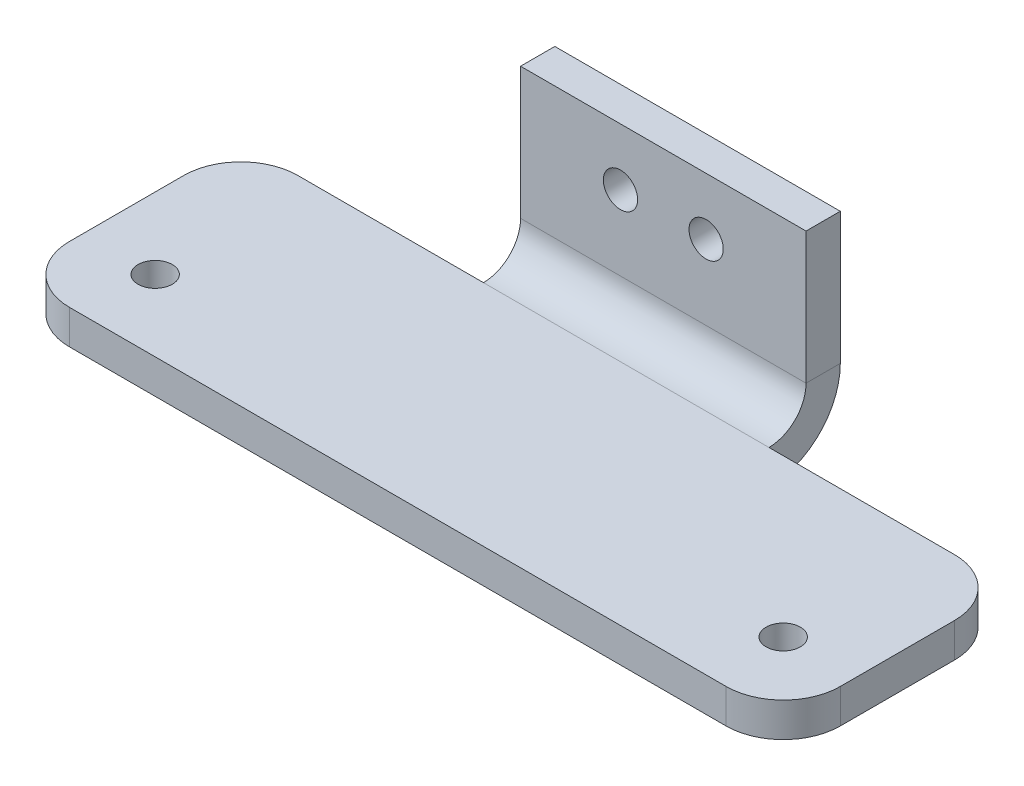
ISO-10303-21;
HEADER;
FILE_DESCRIPTION(('STEP AP214'),'2;1');
FILE_NAME('part.step','',(''),(''),'','','');
FILE_SCHEMA(('AUTOMOTIVE_DESIGN { 1 0 10303 214 1 1 1 1 }'));
ENDSEC;
DATA;
#1=APPLICATION_CONTEXT('core data for automotive mechanical design processes');
#2=APPLICATION_PROTOCOL_DEFINITION('international standard','automotive_design',2000,#1);
#3=PRODUCT_CONTEXT('',#1,'mechanical');
#4=PRODUCT('Part','Part','',(#3));
#5=PRODUCT_RELATED_PRODUCT_CATEGORY('part','',(#4));
#6=PRODUCT_DEFINITION_FORMATION('','',#4);
#7=PRODUCT_DEFINITION_CONTEXT('part definition',#1,'design');
#8=PRODUCT_DEFINITION('design','',#6,#7);
#9=PRODUCT_DEFINITION_SHAPE('','',#8);
#10=(LENGTH_UNIT() NAMED_UNIT(*) SI_UNIT(.MILLI.,.METRE.));
#11=(NAMED_UNIT(*) PLANE_ANGLE_UNIT() SI_UNIT($,.RADIAN.));
#12=(NAMED_UNIT(*) SI_UNIT($,.STERADIAN.) SOLID_ANGLE_UNIT());
#13=UNCERTAINTY_MEASURE_WITH_UNIT(LENGTH_MEASURE(1.E-05),#10,'distance_accuracy_value','');
#14=(GEOMETRIC_REPRESENTATION_CONTEXT(3) GLOBAL_UNCERTAINTY_ASSIGNED_CONTEXT((#13)) GLOBAL_UNIT_ASSIGNED_CONTEXT((#10,
#11,#12)) REPRESENTATION_CONTEXT('',''));
#15=CARTESIAN_POINT('',(0.,0.,0.));
#16=DIRECTION('',(0.,0.,1.));
#17=DIRECTION('',(1.,0.,0.));
#18=AXIS2_PLACEMENT_3D('',#15,#16,#17);
#19=CARTESIAN_POINT('',(0.,-28.4225651045515,-32.5000000000001));
#20=DIRECTION('',(0.,0.,1.));
#21=DIRECTION('',(0.,-1.,0.));
#22=AXIS2_PLACEMENT_3D('',#19,#20,#21);
#23=PLANE('',#22);
#24=CARTESIAN_POINT('',(-7.5,19.5774348954485,-32.5));
#25=DIRECTION('',(0.,0.,1.));
#26=DIRECTION('',(1.,0.,0.));
#27=AXIS2_PLACEMENT_3D('',#24,#25,#26);
#28=CIRCLE('',#27,3.);
#29=CARTESIAN_POINT('',(-4.5,19.5774348954485,-32.5));
#30=VERTEX_POINT('',#29);
#31=EDGE_CURVE('E394',#30,#30,#28,.T.);
#32=ORIENTED_EDGE('',*,*,#31,.T.);
#33=EDGE_LOOP('',(#32));
#34=FACE_BOUND('',#33,.T.);
#35=CARTESIAN_POINT('',(7.5,19.5774348954485,-32.5));
#36=DIRECTION('',(0.,0.,1.));
#37=DIRECTION('',(-1.,0.,0.));
#38=AXIS2_PLACEMENT_3D('',#35,#36,#37);
#39=CIRCLE('',#38,3.);
#40=CARTESIAN_POINT('',(4.5,19.5774348954485,-32.5));
#41=VERTEX_POINT('',#40);
#42=EDGE_CURVE('E398',#41,#41,#39,.T.);
#43=ORIENTED_EDGE('',*,*,#42,.T.);
#44=EDGE_LOOP('',(#43));
#45=FACE_BOUND('',#44,.T.);
#46=DIRECTION('',(0.,1.,0.));
#47=VECTOR('',#46,1.);
#48=CARTESIAN_POINT('',(25.,29.5774348954485,-32.4999999999999));
#49=LINE('',#48,#47);
#50=CARTESIAN_POINT('',(25.,6.50000000000005,-32.5));
#51=VERTEX_POINT('',#50);
#52=CARTESIAN_POINT('',(25.,29.5774348954485,-32.4999999999999));
#53=VERTEX_POINT('',#52);
#54=EDGE_CURVE('E172',#51,#53,#49,.T.);
#55=ORIENTED_EDGE('',*,*,#54,.F.);
#56=DIRECTION('',(-1.,0.,0.));
#57=VECTOR('',#56,1.);
#58=CARTESIAN_POINT('',(0.,6.50000000000005,-32.5));
#59=LINE('',#58,#57);
#60=CARTESIAN_POINT('',(-25.,6.50000000000005,-32.5));
#61=VERTEX_POINT('',#60);
#62=EDGE_CURVE('E146',#51,#61,#59,.T.);
#63=ORIENTED_EDGE('',*,*,#62,.T.);
#64=DIRECTION('',(0.,-1.,0.));
#65=VECTOR('',#64,1.);
#66=CARTESIAN_POINT('',(-25.,29.5774348954485,-32.4999999999999));
#67=LINE('',#66,#65);
#68=CARTESIAN_POINT('',(-25.,29.5774348954485,-32.4999999999999));
#69=VERTEX_POINT('',#68);
#70=EDGE_CURVE('E192',#69,#61,#67,.T.);
#71=ORIENTED_EDGE('',*,*,#70,.F.);
#72=DIRECTION('',(-1.,0.,0.));
#73=VECTOR('',#72,1.);
#74=CARTESIAN_POINT('',(-25.,29.5774348954485,-32.4999999999999));
#75=LINE('',#74,#73);
#76=EDGE_CURVE('E174',#53,#69,#75,.T.);
#77=ORIENTED_EDGE('',*,*,#76,.F.);
#78=EDGE_LOOP('',(#55,#63,#71,#77));
#79=FACE_BOUND('',#78,.T.);
#80=ADVANCED_FACE('F43',(#34,#45,#79),#23,.F.);
#81=CARTESIAN_POINT('',(-25.,29.5774348954485,-32.4999999999999));
#82=DIRECTION('',(-1.,0.,0.));
#83=DIRECTION('',(0.,-1.,0.));
#84=AXIS2_PLACEMENT_3D('',#81,#82,#83);
#85=PLANE('',#84);
#86=DIRECTION('',(0.,0.,-1.));
#87=VECTOR('',#86,1.);
#88=CARTESIAN_POINT('',(-25.,6.50000000000005,-32.5));
#89=LINE('',#88,#87);
#90=CARTESIAN_POINT('',(-25.,6.50000000000002,-26.5));
#91=VERTEX_POINT('',#90);
#92=EDGE_CURVE('E186',#91,#61,#89,.T.);
#93=ORIENTED_EDGE('',*,*,#92,.F.);
#94=DIRECTION('',(0.,-1.,0.));
#95=VECTOR('',#94,1.);
#96=CARTESIAN_POINT('',(-25.,29.5774348954485,-26.4999999999999));
#97=LINE('',#96,#95);
#98=CARTESIAN_POINT('',(-25.,29.5774348954485,-26.4999999999999));
#99=VERTEX_POINT('',#98);
#100=EDGE_CURVE('E178',#99,#91,#97,.T.);
#101=ORIENTED_EDGE('',*,*,#100,.F.);
#102=DIRECTION('',(0.,0.,1.));
#103=VECTOR('',#102,1.);
#104=CARTESIAN_POINT('',(-25.,29.5774348954485,-32.4999999999999));
#105=LINE('',#104,#103);
#106=EDGE_CURVE('E159',#69,#99,#105,.T.);
#107=ORIENTED_EDGE('',*,*,#106,.F.);
#108=ORIENTED_EDGE('',*,*,#70,.T.);
#109=EDGE_LOOP('',(#93,#101,#107,#108));
#110=FACE_BOUND('',#109,.T.);
#111=ADVANCED_FACE('F321',(#110),#85,.T.);
#112=CARTESIAN_POINT('',(-25.,29.5774348954485,-32.4999999999999));
#113=DIRECTION('',(0.,1.,0.));
#114=DIRECTION('',(-1.,0.,0.));
#115=AXIS2_PLACEMENT_3D('',#112,#113,#114);
#116=PLANE('',#115);
#117=DIRECTION('',(-1.,0.,0.));
#118=VECTOR('',#117,1.);
#119=CARTESIAN_POINT('',(-25.,29.5774348954485,-26.4999999999999));
#120=LINE('',#119,#118);
#121=CARTESIAN_POINT('',(25.,29.5774348954485,-26.4999999999999));
#122=VERTEX_POINT('',#121);
#123=EDGE_CURVE('E197',#122,#99,#120,.T.);
#124=ORIENTED_EDGE('',*,*,#123,.F.);
#125=DIRECTION('',(0.,0.,1.));
#126=VECTOR('',#125,1.);
#127=CARTESIAN_POINT('',(25.,29.5774348954485,-32.4999999999999));
#128=LINE('',#127,#126);
#129=EDGE_CURVE('E194',#53,#122,#128,.T.);
#130=ORIENTED_EDGE('',*,*,#129,.F.);
#131=ORIENTED_EDGE('',*,*,#76,.T.);
#132=ORIENTED_EDGE('',*,*,#106,.T.);
#133=EDGE_LOOP('',(#124,#130,#131,#132));
#134=FACE_BOUND('',#133,.T.);
#135=ADVANCED_FACE('F274',(#134),#116,.T.);
#136=CARTESIAN_POINT('',(25.,29.5774348954485,-32.4999999999999));
#137=DIRECTION('',(1.,0.,0.));
#138=DIRECTION('',(0.,1.,0.));
#139=AXIS2_PLACEMENT_3D('',#136,#137,#138);
#140=PLANE('',#139);
#141=DIRECTION('',(0.,0.,1.));
#142=VECTOR('',#141,1.);
#143=CARTESIAN_POINT('',(25.,6.50000000000005,-32.5));
#144=LINE('',#143,#142);
#145=CARTESIAN_POINT('',(25.,6.50000000000002,-26.5));
#146=VERTEX_POINT('',#145);
#147=EDGE_CURVE('E158',#51,#146,#144,.T.);
#148=ORIENTED_EDGE('',*,*,#147,.F.);
#149=ORIENTED_EDGE('',*,*,#54,.T.);
#150=ORIENTED_EDGE('',*,*,#129,.T.);
#151=DIRECTION('',(0.,1.,0.));
#152=VECTOR('',#151,1.);
#153=CARTESIAN_POINT('',(25.,29.5774348954485,-26.4999999999999));
#154=LINE('',#153,#152);
#155=EDGE_CURVE('E182',#146,#122,#154,.T.);
#156=ORIENTED_EDGE('',*,*,#155,.F.);
#157=EDGE_LOOP('',(#148,#149,#150,#156));
#158=FACE_BOUND('',#157,.T.);
#159=ADVANCED_FACE('F181',(#158),#140,.T.);
#160=CARTESIAN_POINT('',(0.,-28.4225651045515,-26.5000000000001));
#161=DIRECTION('',(0.,0.,1.));
#162=DIRECTION('',(0.,-1.,0.));
#163=AXIS2_PLACEMENT_3D('',#160,#161,#162);
#164=PLANE('',#163);
#165=CARTESIAN_POINT('',(-7.5,19.5774348954485,-26.5));
#166=DIRECTION('',(0.,0.,1.));
#167=DIRECTION('',(1.,0.,0.));
#168=AXIS2_PLACEMENT_3D('',#165,#166,#167);
#169=CIRCLE('',#168,3.);
#170=CARTESIAN_POINT('',(-4.5,19.5774348954485,-26.5));
#171=VERTEX_POINT('',#170);
#172=EDGE_CURVE('E397',#171,#171,#169,.T.);
#173=ORIENTED_EDGE('',*,*,#172,.F.);
#174=EDGE_LOOP('',(#173));
#175=FACE_BOUND('',#174,.T.);
#176=CARTESIAN_POINT('',(7.5,19.5774348954485,-26.5));
#177=DIRECTION('',(0.,0.,1.));
#178=DIRECTION('',(-1.,0.,0.));
#179=AXIS2_PLACEMENT_3D('',#176,#177,#178);
#180=CIRCLE('',#179,3.);
#181=CARTESIAN_POINT('',(4.5,19.5774348954485,-26.5));
#182=VERTEX_POINT('',#181);
#183=EDGE_CURVE('E403',#182,#182,#180,.T.);
#184=ORIENTED_EDGE('',*,*,#183,.F.);
#185=EDGE_LOOP('',(#184));
#186=FACE_BOUND('',#185,.T.);
#187=DIRECTION('',(-1.,0.,0.));
#188=VECTOR('',#187,1.);
#189=CARTESIAN_POINT('',(0.,6.50000000000003,-26.5));
#190=LINE('',#189,#188);
#191=EDGE_CURVE('E184',#146,#91,#190,.T.);
#192=ORIENTED_EDGE('',*,*,#191,.F.);
#193=ORIENTED_EDGE('',*,*,#155,.T.);
#194=ORIENTED_EDGE('',*,*,#123,.T.);
#195=ORIENTED_EDGE('',*,*,#100,.T.);
#196=EDGE_LOOP('',(#192,#193,#194,#195));
#197=FACE_BOUND('',#196,.T.);
#198=ADVANCED_FACE('F277',(#175,#186,#197),#164,.T.);
#199=CARTESIAN_POINT('',(-67.5,-6.,-20.));
#200=DIRECTION('',(-1.,0.,0.));
#201=DIRECTION('',(0.,0.,1.));
#202=AXIS2_PLACEMENT_3D('',#199,#200,#201);
#203=PLANE('',#202);
#204=DIRECTION('',(0.,0.,1.));
#205=VECTOR('',#204,1.);
#206=CARTESIAN_POINT('',(-67.5,-6.,-20.));
#207=LINE('',#206,#205);
#208=CARTESIAN_POINT('',(-67.5,-6.,-10.));
#209=VERTEX_POINT('',#208);
#210=CARTESIAN_POINT('',(-67.5,-6.,9.99999999999999));
#211=VERTEX_POINT('',#210);
#212=EDGE_CURVE('E234',#209,#211,#207,.T.);
#213=ORIENTED_EDGE('',*,*,#212,.T.);
#214=DIRECTION('',(0.,1.,0.));
#215=VECTOR('',#214,1.);
#216=CARTESIAN_POINT('',(-67.5,-6.,9.99999999999999));
#217=LINE('',#216,#215);
#218=CARTESIAN_POINT('',(-67.5,0.,9.99999999999999));
#219=VERTEX_POINT('',#218);
#220=EDGE_CURVE('E51',#211,#219,#217,.T.);
#221=ORIENTED_EDGE('',*,*,#220,.T.);
#222=DIRECTION('',(0.,0.,1.));
#223=VECTOR('',#222,1.);
#224=CARTESIAN_POINT('',(-67.5,0.,-20.));
#225=LINE('',#224,#223);
#226=CARTESIAN_POINT('',(-67.5,0.,-10.));
#227=VERTEX_POINT('',#226);
#228=EDGE_CURVE('E232',#227,#219,#225,.T.);
#229=ORIENTED_EDGE('',*,*,#228,.F.);
#230=DIRECTION('',(0.,1.,0.));
#231=VECTOR('',#230,1.);
#232=CARTESIAN_POINT('',(-67.5,-6.,-10.));
#233=LINE('',#232,#231);
#234=EDGE_CURVE('E225',#227,#209,#233,.F.);
#235=ORIENTED_EDGE('',*,*,#234,.T.);
#236=EDGE_LOOP('',(#213,#221,#229,#235));
#237=FACE_BOUND('',#236,.T.);
#238=ADVANCED_FACE('F231',(#237),#203,.T.);
#239=CARTESIAN_POINT('',(-67.5,-6.,20.));
#240=DIRECTION('',(0.,0.,1.));
#241=DIRECTION('',(1.,0.,0.));
#242=AXIS2_PLACEMENT_3D('',#239,#240,#241);
#243=PLANE('',#242);
#244=DIRECTION('',(1.,0.,0.));
#245=VECTOR('',#244,1.);
#246=CARTESIAN_POINT('',(-67.5,-6.,20.));
#247=LINE('',#246,#245);
#248=CARTESIAN_POINT('',(-57.5,-6.,20.));
#249=VERTEX_POINT('',#248);
#250=CARTESIAN_POINT('',(57.5,-6.,20.));
#251=VERTEX_POINT('',#250);
#252=EDGE_CURVE('E261',#249,#251,#247,.T.);
#253=ORIENTED_EDGE('',*,*,#252,.T.);
#254=DIRECTION('',(0.,1.,0.));
#255=VECTOR('',#254,1.);
#256=CARTESIAN_POINT('',(57.5,-6.,20.));
#257=LINE('',#256,#255);
#258=CARTESIAN_POINT('',(57.5,0.,20.));
#259=VERTEX_POINT('',#258);
#260=EDGE_CURVE('E222',#251,#259,#257,.T.);
#261=ORIENTED_EDGE('',*,*,#260,.T.);
#262=DIRECTION('',(1.,0.,0.));
#263=VECTOR('',#262,1.);
#264=CARTESIAN_POINT('',(-67.5,0.,20.));
#265=LINE('',#264,#263);
#266=CARTESIAN_POINT('',(-57.5,0.,20.));
#267=VERTEX_POINT('',#266);
#268=EDGE_CURVE('E242',#267,#259,#265,.T.);
#269=ORIENTED_EDGE('',*,*,#268,.F.);
#270=DIRECTION('',(0.,1.,0.));
#271=VECTOR('',#270,1.);
#272=CARTESIAN_POINT('',(-57.5,-6.,20.));
#273=LINE('',#272,#271);
#274=EDGE_CURVE('E220',#267,#249,#273,.F.);
#275=ORIENTED_EDGE('',*,*,#274,.T.);
#276=EDGE_LOOP('',(#253,#261,#269,#275));
#277=FACE_BOUND('',#276,.T.);
#278=ADVANCED_FACE('F308',(#277),#243,.T.);
#279=CARTESIAN_POINT('',(67.5,-6.,-20.));
#280=DIRECTION('',(1.,0.,0.));
#281=DIRECTION('',(0.,0.,-1.));
#282=AXIS2_PLACEMENT_3D('',#279,#280,#281);
#283=PLANE('',#282);
#284=DIRECTION('',(0.,0.,-1.));
#285=VECTOR('',#284,1.);
#286=CARTESIAN_POINT('',(67.5,-6.,-20.));
#287=LINE('',#286,#285);
#288=CARTESIAN_POINT('',(67.5,-6.,10.));
#289=VERTEX_POINT('',#288);
#290=CARTESIAN_POINT('',(67.5,-6.,-10.));
#291=VERTEX_POINT('',#290);
#292=EDGE_CURVE('E258',#289,#291,#287,.T.);
#293=ORIENTED_EDGE('',*,*,#292,.T.);
#294=DIRECTION('',(0.,1.,0.));
#295=VECTOR('',#294,1.);
#296=CARTESIAN_POINT('',(67.5,-6.,-10.));
#297=LINE('',#296,#295);
#298=CARTESIAN_POINT('',(67.5,0.,-10.));
#299=VERTEX_POINT('',#298);
#300=EDGE_CURVE('E201',#291,#299,#297,.T.);
#301=ORIENTED_EDGE('',*,*,#300,.T.);
#302=DIRECTION('',(0.,0.,-1.));
#303=VECTOR('',#302,1.);
#304=CARTESIAN_POINT('',(67.5,0.,-20.));
#305=LINE('',#304,#303);
#306=CARTESIAN_POINT('',(67.5,0.,10.));
#307=VERTEX_POINT('',#306);
#308=EDGE_CURVE('E245',#307,#299,#305,.T.);
#309=ORIENTED_EDGE('',*,*,#308,.F.);
#310=DIRECTION('',(0.,1.,0.));
#311=VECTOR('',#310,1.);
#312=CARTESIAN_POINT('',(67.5,-6.,10.));
#313=LINE('',#312,#311);
#314=EDGE_CURVE('E191',#307,#289,#313,.F.);
#315=ORIENTED_EDGE('',*,*,#314,.T.);
#316=EDGE_LOOP('',(#293,#301,#309,#315));
#317=FACE_BOUND('',#316,.T.);
#318=ADVANCED_FACE('F298',(#317),#283,.T.);
#319=CARTESIAN_POINT('',(0.,-6.,0.));
#320=DIRECTION('',(0.,1.,0.));
#321=DIRECTION('',(0.,0.,1.));
#322=AXIS2_PLACEMENT_3D('',#319,#320,#321);
#323=PLANE('',#322);
#324=CARTESIAN_POINT('',(-55.,-6.,7.5));
#325=DIRECTION('',(0.,1.,0.));
#326=DIRECTION('',(0.,0.,1.));
#327=AXIS2_PLACEMENT_3D('',#324,#325,#326);
#328=CIRCLE('',#327,3.);
#329=CARTESIAN_POINT('',(-55.,-6.,10.5));
#330=VERTEX_POINT('',#329);
#331=EDGE_CURVE('E290',#330,#330,#328,.T.);
#332=ORIENTED_EDGE('',*,*,#331,.T.);
#333=EDGE_LOOP('',(#332));
#334=FACE_BOUND('',#333,.T.);
#335=CARTESIAN_POINT('',(55.,-6.,7.49999999999999));
#336=DIRECTION('',(0.,1.,0.));
#337=DIRECTION('',(0.,0.,-1.));
#338=AXIS2_PLACEMENT_3D('',#335,#336,#337);
#339=CIRCLE('',#338,3.);
#340=CARTESIAN_POINT('',(55.,-6.,4.49999999999999));
#341=VERTEX_POINT('',#340);
#342=EDGE_CURVE('E413',#341,#341,#339,.T.);
#343=ORIENTED_EDGE('',*,*,#342,.T.);
#344=EDGE_LOOP('',(#343));
#345=FACE_BOUND('',#344,.T.);
#346=DIRECTION('',(-1.,0.,0.));
#347=VECTOR('',#346,1.);
#348=CARTESIAN_POINT('',(25.,-6.,-20.));
#349=LINE('',#348,#347);
#350=CARTESIAN_POINT('',(57.5,-6.,-20.));
#351=VERTEX_POINT('',#350);
#352=CARTESIAN_POINT('',(25.,-6.,-20.));
#353=VERTEX_POINT('',#352);
#354=EDGE_CURVE('E256',#351,#353,#349,.T.);
#355=ORIENTED_EDGE('',*,*,#354,.F.);
#356=CARTESIAN_POINT('',(57.5,-6.,-10.));
#357=DIRECTION('',(0.,1.,0.));
#358=DIRECTION('',(0.,0.,1.));
#359=AXIS2_PLACEMENT_3D('',#356,#357,#358);
#360=CIRCLE('',#359,10.);
#361=EDGE_CURVE('E218',#351,#291,#360,.F.);
#362=ORIENTED_EDGE('',*,*,#361,.T.);
#363=ORIENTED_EDGE('',*,*,#292,.F.);
#364=CARTESIAN_POINT('',(57.5,-6.,10.));
#365=DIRECTION('',(0.,1.,0.));
#366=DIRECTION('',(0.,0.,1.));
#367=AXIS2_PLACEMENT_3D('',#364,#365,#366);
#368=CIRCLE('',#367,10.);
#369=EDGE_CURVE('E216',#289,#251,#368,.F.);
#370=ORIENTED_EDGE('',*,*,#369,.T.);
#371=ORIENTED_EDGE('',*,*,#252,.F.);
#372=CARTESIAN_POINT('',(-57.5,-6.,10.));
#373=DIRECTION('',(0.,1.,0.));
#374=DIRECTION('',(0.,0.,1.));
#375=AXIS2_PLACEMENT_3D('',#372,#373,#374);
#376=CIRCLE('',#375,10.);
#377=EDGE_CURVE('E64',#249,#211,#376,.F.);
#378=ORIENTED_EDGE('',*,*,#377,.T.);
#379=ORIENTED_EDGE('',*,*,#212,.F.);
#380=CARTESIAN_POINT('',(-57.5,-6.,-10.));
#381=DIRECTION('',(0.,1.,0.));
#382=DIRECTION('',(0.,0.,1.));
#383=AXIS2_PLACEMENT_3D('',#380,#381,#382);
#384=CIRCLE('',#383,10.);
#385=CARTESIAN_POINT('',(-57.5,-6.,-20.));
#386=VERTEX_POINT('',#385);
#387=EDGE_CURVE('E58',#209,#386,#384,.F.);
#388=ORIENTED_EDGE('',*,*,#387,.T.);
#389=DIRECTION('',(-1.,0.,0.));
#390=VECTOR('',#389,1.);
#391=CARTESIAN_POINT('',(-67.5,-6.,-20.));
#392=LINE('',#391,#390);
#393=CARTESIAN_POINT('',(-25.,-6.,-20.));
#394=VERTEX_POINT('',#393);
#395=EDGE_CURVE('E198',#394,#386,#392,.T.);
#396=ORIENTED_EDGE('',*,*,#395,.F.);
#397=DIRECTION('',(-1.,0.,0.));
#398=VECTOR('',#397,1.);
#399=CARTESIAN_POINT('',(0.,-6.,-20.));
#400=LINE('',#399,#398);
#401=EDGE_CURVE('E267',#353,#394,#400,.T.);
#402=ORIENTED_EDGE('',*,*,#401,.F.);
#403=EDGE_LOOP('',(#355,#362,#363,#370,#371,#378,#379,#388,#396,#402));
#404=FACE_BOUND('',#403,.T.);
#405=ADVANCED_FACE('F306',(#334,#345,#404),#323,.F.);
#406=CARTESIAN_POINT('',(25.,-6.,-20.));
#407=DIRECTION('',(0.,0.,-1.));
#408=DIRECTION('',(-1.,0.,0.));
#409=AXIS2_PLACEMENT_3D('',#406,#407,#408);
#410=PLANE('',#409);
#411=DIRECTION('',(-1.,0.,0.));
#412=VECTOR('',#411,1.);
#413=CARTESIAN_POINT('',(25.,0.,-20.));
#414=LINE('',#413,#412);
#415=CARTESIAN_POINT('',(57.5,0.,-20.));
#416=VERTEX_POINT('',#415);
#417=CARTESIAN_POINT('',(25.,0.,-20.));
#418=VERTEX_POINT('',#417);
#419=EDGE_CURVE('E253',#416,#418,#414,.T.);
#420=ORIENTED_EDGE('',*,*,#419,.F.);
#421=DIRECTION('',(0.,1.,0.));
#422=VECTOR('',#421,1.);
#423=CARTESIAN_POINT('',(57.5,-6.,-20.));
#424=LINE('',#423,#422);
#425=EDGE_CURVE('E212',#416,#351,#424,.F.);
#426=ORIENTED_EDGE('',*,*,#425,.T.);
#427=ORIENTED_EDGE('',*,*,#354,.T.);
#428=DIRECTION('',(0.,1.,0.));
#429=VECTOR('',#428,1.);
#430=CARTESIAN_POINT('',(25.,-6.,-20.));
#431=LINE('',#430,#429);
#432=EDGE_CURVE('E168',#353,#418,#431,.T.);
#433=ORIENTED_EDGE('',*,*,#432,.T.);
#434=EDGE_LOOP('',(#420,#426,#427,#433));
#435=FACE_BOUND('',#434,.T.);
#436=ADVANCED_FACE('F351',(#435),#410,.T.);
#437=CARTESIAN_POINT('',(0.,0.,0.));
#438=DIRECTION('',(0.,1.,0.));
#439=DIRECTION('',(0.,0.,1.));
#440=AXIS2_PLACEMENT_3D('',#437,#438,#439);
#441=PLANE('',#440);
#442=CARTESIAN_POINT('',(-55.,0.,7.5));
#443=DIRECTION('',(0.,1.,0.));
#444=DIRECTION('',(0.,0.,1.));
#445=AXIS2_PLACEMENT_3D('',#442,#443,#444);
#446=CIRCLE('',#445,3.);
#447=CARTESIAN_POINT('',(-55.,0.,10.5));
#448=VERTEX_POINT('',#447);
#449=EDGE_CURVE('E410',#448,#448,#446,.T.);
#450=ORIENTED_EDGE('',*,*,#449,.F.);
#451=EDGE_LOOP('',(#450));
#452=FACE_BOUND('',#451,.T.);
#453=CARTESIAN_POINT('',(55.,0.,7.49999999999999));
#454=DIRECTION('',(0.,1.,0.));
#455=DIRECTION('',(0.,0.,-1.));
#456=AXIS2_PLACEMENT_3D('',#453,#454,#455);
#457=CIRCLE('',#456,3.);
#458=CARTESIAN_POINT('',(55.,0.,4.49999999999999));
#459=VERTEX_POINT('',#458);
#460=EDGE_CURVE('E400',#459,#459,#457,.T.);
#461=ORIENTED_EDGE('',*,*,#460,.F.);
#462=EDGE_LOOP('',(#461));
#463=FACE_BOUND('',#462,.T.);
#464=ORIENTED_EDGE('',*,*,#308,.T.);
#465=CARTESIAN_POINT('',(57.5,0.,-10.));
#466=DIRECTION('',(0.,1.,0.));
#467=DIRECTION('',(0.,0.,1.));
#468=AXIS2_PLACEMENT_3D('',#465,#466,#467);
#469=CIRCLE('',#468,10.);
#470=EDGE_CURVE('E210',#299,#416,#469,.T.);
#471=ORIENTED_EDGE('',*,*,#470,.T.);
#472=ORIENTED_EDGE('',*,*,#419,.T.);
#473=DIRECTION('',(-1.,0.,0.));
#474=VECTOR('',#473,1.);
#475=CARTESIAN_POINT('',(0.,0.,-20.));
#476=LINE('',#475,#474);
#477=CARTESIAN_POINT('',(-25.,0.,-20.));
#478=VERTEX_POINT('',#477);
#479=EDGE_CURVE('E247',#418,#478,#476,.T.);
#480=ORIENTED_EDGE('',*,*,#479,.T.);
#481=DIRECTION('',(-1.,0.,0.));
#482=VECTOR('',#481,1.);
#483=CARTESIAN_POINT('',(-67.5,0.,-20.));
#484=LINE('',#483,#482);
#485=CARTESIAN_POINT('',(-57.5,0.,-20.));
#486=VERTEX_POINT('',#485);
#487=EDGE_CURVE('E243',#478,#486,#484,.T.);
#488=ORIENTED_EDGE('',*,*,#487,.T.);
#489=CARTESIAN_POINT('',(-57.5,0.,-10.));
#490=DIRECTION('',(0.,1.,0.));
#491=DIRECTION('',(0.,0.,1.));
#492=AXIS2_PLACEMENT_3D('',#489,#490,#491);
#493=CIRCLE('',#492,10.);
#494=EDGE_CURVE('E204',#486,#227,#493,.T.);
#495=ORIENTED_EDGE('',*,*,#494,.T.);
#496=ORIENTED_EDGE('',*,*,#228,.T.);
#497=CARTESIAN_POINT('',(-57.5,0.,10.));
#498=DIRECTION('',(0.,1.,0.));
#499=DIRECTION('',(0.,0.,1.));
#500=AXIS2_PLACEMENT_3D('',#497,#498,#499);
#501=CIRCLE('',#500,10.);
#502=EDGE_CURVE('E206',#219,#267,#501,.T.);
#503=ORIENTED_EDGE('',*,*,#502,.T.);
#504=ORIENTED_EDGE('',*,*,#268,.T.);
#505=CARTESIAN_POINT('',(57.5,0.,10.));
#506=DIRECTION('',(0.,1.,0.));
#507=DIRECTION('',(0.,0.,1.));
#508=AXIS2_PLACEMENT_3D('',#505,#506,#507);
#509=CIRCLE('',#508,10.);
#510=EDGE_CURVE('E208',#259,#307,#509,.T.);
#511=ORIENTED_EDGE('',*,*,#510,.T.);
#512=EDGE_LOOP('',(#464,#471,#472,#480,#488,#495,#496,#503,#504,#511));
#513=FACE_BOUND('',#512,.T.);
#514=ADVANCED_FACE('F238',(#452,#463,#513),#441,.T.);
#515=CARTESIAN_POINT('',(-67.5,-6.,-20.));
#516=DIRECTION('',(0.,0.,-1.));
#517=DIRECTION('',(-1.,0.,0.));
#518=AXIS2_PLACEMENT_3D('',#515,#516,#517);
#519=PLANE('',#518);
#520=ORIENTED_EDGE('',*,*,#395,.T.);
#521=DIRECTION('',(0.,1.,0.));
#522=VECTOR('',#521,1.);
#523=CARTESIAN_POINT('',(-57.5,-6.,-20.));
#524=LINE('',#523,#522);
#525=EDGE_CURVE('E12',#386,#486,#524,.T.);
#526=ORIENTED_EDGE('',*,*,#525,.T.);
#527=ORIENTED_EDGE('',*,*,#487,.F.);
#528=DIRECTION('',(0.,1.,0.));
#529=VECTOR('',#528,1.);
#530=CARTESIAN_POINT('',(-25.,-6.,-20.));
#531=LINE('',#530,#529);
#532=EDGE_CURVE('E265',#394,#478,#531,.T.);
#533=ORIENTED_EDGE('',*,*,#532,.F.);
#534=EDGE_LOOP('',(#520,#526,#527,#533));
#535=FACE_BOUND('',#534,.T.);
#536=ADVANCED_FACE('F353',(#535),#519,.T.);
#537=CARTESIAN_POINT('',(25.,6.5,-20.));
#538=DIRECTION('',(1.,0.,0.));
#539=DIRECTION('',(0.,0.,-1.));
#540=AXIS2_PLACEMENT_3D('',#537,#538,#539);
#541=PLANE('',#540);
#542=ORIENTED_EDGE('',*,*,#147,.T.);
#543=CARTESIAN_POINT('',(25.,6.5,-20.));
#544=DIRECTION('',(1.,0.,0.));
#545=DIRECTION('',(0.,0.,-1.));
#546=AXIS2_PLACEMENT_3D('',#543,#544,#545);
#547=CIRCLE('',#546,6.5);
#548=EDGE_CURVE('E285',#146,#418,#547,.F.);
#549=ORIENTED_EDGE('',*,*,#548,.T.);
#550=ORIENTED_EDGE('',*,*,#432,.F.);
#551=CARTESIAN_POINT('',(25.,6.5,-20.));
#552=DIRECTION('',(-1.,0.,0.));
#553=DIRECTION('',(0.,0.,-1.));
#554=AXIS2_PLACEMENT_3D('',#551,#552,#553);
#555=CIRCLE('',#554,12.5);
#556=EDGE_CURVE('E149',#51,#353,#555,.T.);
#557=ORIENTED_EDGE('',*,*,#556,.F.);
#558=EDGE_LOOP('',(#542,#549,#550,#557));
#559=FACE_BOUND('',#558,.T.);
#560=ADVANCED_FACE('F163',(#559),#541,.T.);
#561=CARTESIAN_POINT('',(-25.,6.5,-20.));
#562=DIRECTION('',(-1.,0.,0.));
#563=DIRECTION('',(0.,0.,1.));
#564=AXIS2_PLACEMENT_3D('',#561,#562,#563);
#565=PLANE('',#564);
#566=CARTESIAN_POINT('',(-25.,6.5,-20.));
#567=DIRECTION('',(1.,0.,0.));
#568=DIRECTION('',(0.,0.,-1.));
#569=AXIS2_PLACEMENT_3D('',#566,#567,#568);
#570=CIRCLE('',#569,6.5);
#571=EDGE_CURVE('E169',#478,#91,#570,.T.);
#572=ORIENTED_EDGE('',*,*,#571,.T.);
#573=ORIENTED_EDGE('',*,*,#92,.T.);
#574=CARTESIAN_POINT('',(-25.,6.5,-20.));
#575=DIRECTION('',(1.,0.,0.));
#576=DIRECTION('',(0.,0.,1.));
#577=AXIS2_PLACEMENT_3D('',#574,#575,#576);
#578=CIRCLE('',#577,12.5);
#579=EDGE_CURVE('E152',#394,#61,#578,.T.);
#580=ORIENTED_EDGE('',*,*,#579,.F.);
#581=ORIENTED_EDGE('',*,*,#532,.T.);
#582=EDGE_LOOP('',(#572,#573,#580,#581));
#583=FACE_BOUND('',#582,.T.);
#584=ADVANCED_FACE('F287',(#583),#565,.T.);
#585=CARTESIAN_POINT('',(-52.5231658347017,6.5,-20.));
#586=DIRECTION('',(1.,0.,0.));
#587=DIRECTION('',(0.,0.,-1.));
#588=AXIS2_PLACEMENT_3D('',#585,#586,#587);
#589=CYLINDRICAL_SURFACE('',#588,12.5);
#590=ORIENTED_EDGE('',*,*,#401,.T.);
#591=ORIENTED_EDGE('',*,*,#579,.T.);
#592=ORIENTED_EDGE('',*,*,#62,.F.);
#593=ORIENTED_EDGE('',*,*,#556,.T.);
#594=EDGE_LOOP('',(#590,#591,#592,#593));
#595=FACE_BOUND('',#594,.T.);
#596=ADVANCED_FACE('F148',(#595),#589,.T.);
#597=CARTESIAN_POINT('',(-52.5231658347017,6.5,-20.));
#598=DIRECTION('',(1.,0.,0.));
#599=DIRECTION('',(0.,0.,-1.));
#600=AXIS2_PLACEMENT_3D('',#597,#598,#599);
#601=CYLINDRICAL_SURFACE('',#600,6.5);
#602=ORIENTED_EDGE('',*,*,#479,.F.);
#603=ORIENTED_EDGE('',*,*,#548,.F.);
#604=ORIENTED_EDGE('',*,*,#191,.T.);
#605=ORIENTED_EDGE('',*,*,#571,.F.);
#606=EDGE_LOOP('',(#602,#603,#604,#605));
#607=FACE_BOUND('',#606,.T.);
#608=ADVANCED_FACE('F283',(#607),#601,.F.);
#609=CARTESIAN_POINT('',(55.,-6.,7.49999999999999));
#610=DIRECTION('',(0.,1.,0.));
#611=DIRECTION('',(0.,0.,1.));
#612=AXIS2_PLACEMENT_3D('',#609,#610,#611);
#613=CYLINDRICAL_SURFACE('',#612,3.);
#614=ORIENTED_EDGE('',*,*,#342,.F.);
#615=EDGE_LOOP('',(#614));
#616=FACE_BOUND('',#615,.T.);
#617=ORIENTED_EDGE('',*,*,#460,.T.);
#618=EDGE_LOOP('',(#617));
#619=FACE_BOUND('',#618,.T.);
#620=ADVANCED_FACE('F345',(#616,#619),#613,.F.);
#621=CARTESIAN_POINT('',(-55.,-6.,7.5));
#622=DIRECTION('',(0.,1.,0.));
#623=DIRECTION('',(0.,0.,1.));
#624=AXIS2_PLACEMENT_3D('',#621,#622,#623);
#625=CYLINDRICAL_SURFACE('',#624,3.);
#626=ORIENTED_EDGE('',*,*,#331,.F.);
#627=EDGE_LOOP('',(#626));
#628=FACE_BOUND('',#627,.T.);
#629=ORIENTED_EDGE('',*,*,#449,.T.);
#630=EDGE_LOOP('',(#629));
#631=FACE_BOUND('',#630,.T.);
#632=ADVANCED_FACE('F340',(#628,#631),#625,.F.);
#633=CARTESIAN_POINT('',(57.5,-6.,-10.));
#634=DIRECTION('',(0.,1.,0.));
#635=DIRECTION('',(0.,0.,1.));
#636=AXIS2_PLACEMENT_3D('',#633,#634,#635);
#637=CYLINDRICAL_SURFACE('',#636,10.);
#638=ORIENTED_EDGE('',*,*,#361,.F.);
#639=ORIENTED_EDGE('',*,*,#425,.F.);
#640=ORIENTED_EDGE('',*,*,#470,.F.);
#641=ORIENTED_EDGE('',*,*,#300,.F.);
#642=EDGE_LOOP('',(#638,#639,#640,#641));
#643=FACE_BOUND('',#642,.T.);
#644=ADVANCED_FACE('F318',(#643),#637,.T.);
#645=CARTESIAN_POINT('',(57.5,-6.,10.));
#646=DIRECTION('',(0.,1.,0.));
#647=DIRECTION('',(0.,0.,1.));
#648=AXIS2_PLACEMENT_3D('',#645,#646,#647);
#649=CYLINDRICAL_SURFACE('',#648,10.);
#650=ORIENTED_EDGE('',*,*,#369,.F.);
#651=ORIENTED_EDGE('',*,*,#314,.F.);
#652=ORIENTED_EDGE('',*,*,#510,.F.);
#653=ORIENTED_EDGE('',*,*,#260,.F.);
#654=EDGE_LOOP('',(#650,#651,#652,#653));
#655=FACE_BOUND('',#654,.T.);
#656=ADVANCED_FACE('F303',(#655),#649,.T.);
#657=CARTESIAN_POINT('',(-57.5,-6.,10.));
#658=DIRECTION('',(0.,1.,0.));
#659=DIRECTION('',(0.,0.,1.));
#660=AXIS2_PLACEMENT_3D('',#657,#658,#659);
#661=CYLINDRICAL_SURFACE('',#660,10.);
#662=ORIENTED_EDGE('',*,*,#377,.F.);
#663=ORIENTED_EDGE('',*,*,#274,.F.);
#664=ORIENTED_EDGE('',*,*,#502,.F.);
#665=ORIENTED_EDGE('',*,*,#220,.F.);
#666=EDGE_LOOP('',(#662,#663,#664,#665));
#667=FACE_BOUND('',#666,.T.);
#668=ADVANCED_FACE('F310',(#667),#661,.T.);
#669=CARTESIAN_POINT('',(-57.5,-6.,-10.));
#670=DIRECTION('',(0.,1.,0.));
#671=DIRECTION('',(0.,0.,1.));
#672=AXIS2_PLACEMENT_3D('',#669,#670,#671);
#673=CYLINDRICAL_SURFACE('',#672,10.);
#674=ORIENTED_EDGE('',*,*,#387,.F.);
#675=ORIENTED_EDGE('',*,*,#234,.F.);
#676=ORIENTED_EDGE('',*,*,#494,.F.);
#677=ORIENTED_EDGE('',*,*,#525,.F.);
#678=EDGE_LOOP('',(#674,#675,#676,#677));
#679=FACE_BOUND('',#678,.T.);
#680=ADVANCED_FACE('F45',(#679),#673,.T.);
#681=CARTESIAN_POINT('',(7.5,19.5774348954485,-32.5));
#682=DIRECTION('',(0.,0.,1.));
#683=DIRECTION('',(1.,0.,0.));
#684=AXIS2_PLACEMENT_3D('',#681,#682,#683);
#685=CYLINDRICAL_SURFACE('',#684,3.);
#686=ORIENTED_EDGE('',*,*,#42,.F.);
#687=EDGE_LOOP('',(#686));
#688=FACE_BOUND('',#687,.T.);
#689=ORIENTED_EDGE('',*,*,#183,.T.);
#690=EDGE_LOOP('',(#689));
#691=FACE_BOUND('',#690,.T.);
#692=ADVANCED_FACE('F316',(#688,#691),#685,.F.);
#693=CARTESIAN_POINT('',(-7.5,19.5774348954485,-32.5));
#694=DIRECTION('',(0.,0.,1.));
#695=DIRECTION('',(1.,0.,0.));
#696=AXIS2_PLACEMENT_3D('',#693,#694,#695);
#697=CYLINDRICAL_SURFACE('',#696,3.);
#698=ORIENTED_EDGE('',*,*,#31,.F.);
#699=EDGE_LOOP('',(#698));
#700=FACE_BOUND('',#699,.T.);
#701=ORIENTED_EDGE('',*,*,#172,.T.);
#702=EDGE_LOOP('',(#701));
#703=FACE_BOUND('',#702,.T.);
#704=ADVANCED_FACE('F386',(#700,#703),#697,.F.);
#705=CLOSED_SHELL('',(#80,#111,#135,#159,#198,#238,#278,#318,#405,#436,#514,#536,#560,#584,#596,
#608,#620,#632,#644,#656,#668,#680,#692,#704));
#706=MANIFOLD_SOLID_BREP('B2',#705);
#707=ADVANCED_BREP_SHAPE_REPRESENTATION('',(#18,#706),#14);
#708=SHAPE_DEFINITION_REPRESENTATION(#9,#707);
ENDSEC;
END-ISO-10303-21;
